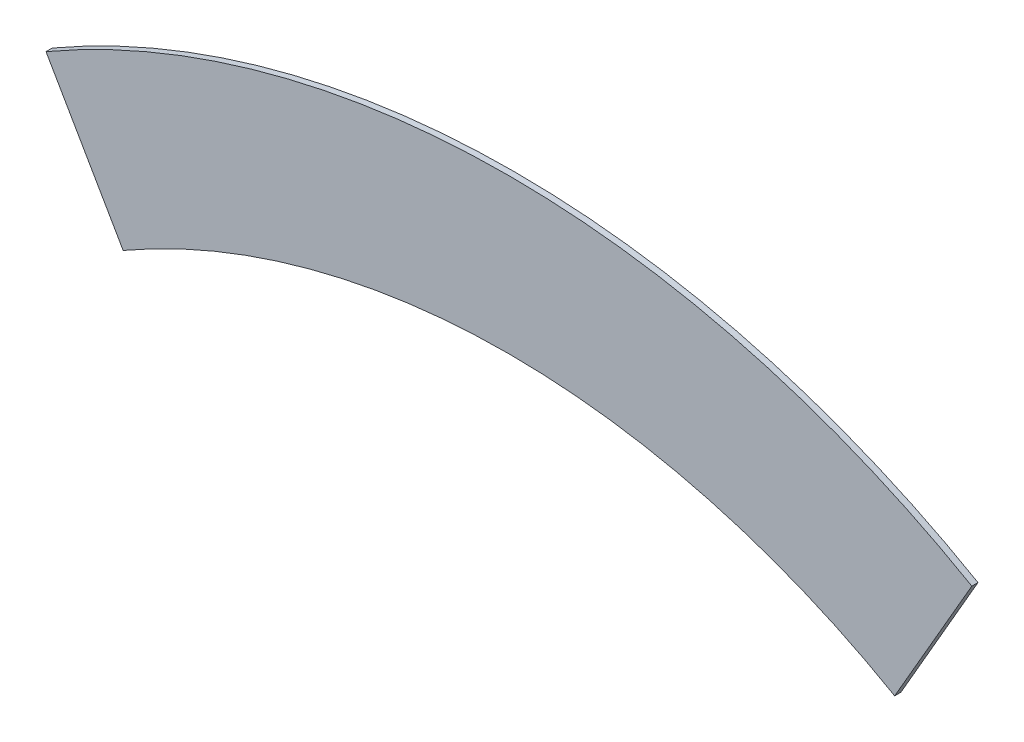
ISO-10303-21;
HEADER;
FILE_DESCRIPTION(('STEP AP214'),'2;1');
FILE_NAME('part.step','',(''),(''),'','','');
FILE_SCHEMA(('AUTOMOTIVE_DESIGN { 1 0 10303 214 1 1 1 1 }'));
ENDSEC;
DATA;
#1=APPLICATION_CONTEXT('core data for automotive mechanical design processes');
#2=APPLICATION_PROTOCOL_DEFINITION('international standard','automotive_design',2000,#1);
#3=PRODUCT_CONTEXT('',#1,'mechanical');
#4=PRODUCT('Part','Part','',(#3));
#5=PRODUCT_RELATED_PRODUCT_CATEGORY('part','',(#4));
#6=PRODUCT_DEFINITION_FORMATION('','',#4);
#7=PRODUCT_DEFINITION_CONTEXT('part definition',#1,'design');
#8=PRODUCT_DEFINITION('design','',#6,#7);
#9=PRODUCT_DEFINITION_SHAPE('','',#8);
#10=(LENGTH_UNIT() NAMED_UNIT(*) SI_UNIT(.MILLI.,.METRE.));
#11=(NAMED_UNIT(*) PLANE_ANGLE_UNIT() SI_UNIT($,.RADIAN.));
#12=(NAMED_UNIT(*) SI_UNIT($,.STERADIAN.) SOLID_ANGLE_UNIT());
#13=UNCERTAINTY_MEASURE_WITH_UNIT(LENGTH_MEASURE(1.E-05),#10,'distance_accuracy_value','');
#14=(GEOMETRIC_REPRESENTATION_CONTEXT(3) GLOBAL_UNCERTAINTY_ASSIGNED_CONTEXT((#13)) GLOBAL_UNIT_ASSIGNED_CONTEXT((#10,
#11,#12)) REPRESENTATION_CONTEXT('',''));
#15=CARTESIAN_POINT('',(0.,0.,0.));
#16=DIRECTION('',(0.,0.,1.));
#17=DIRECTION('',(1.,0.,0.));
#18=AXIS2_PLACEMENT_3D('',#15,#16,#17);
#19=CARTESIAN_POINT('',(0.,0.,0.2));
#20=DIRECTION('',(0.,0.,-1.));
#21=DIRECTION('',(-1.,0.,0.));
#22=AXIS2_PLACEMENT_3D('',#19,#20,#21);
#23=CYLINDRICAL_SURFACE('',#22,25.);
#24=CARTESIAN_POINT('',(0.,0.,0.));
#25=DIRECTION('',(0.,0.,-1.));
#26=DIRECTION('',(1.,0.,0.));
#27=AXIS2_PLACEMENT_3D('',#24,#25,#26);
#28=CIRCLE('',#27,25.);
#29=CARTESIAN_POINT('',(-12.5,21.650635094611,0.));
#30=VERTEX_POINT('',#29);
#31=CARTESIAN_POINT('',(12.5,21.650635094611,0.));
#32=VERTEX_POINT('',#31);
#33=EDGE_CURVE('E111',#30,#32,#28,.T.);
#34=ORIENTED_EDGE('',*,*,#33,.T.);
#35=DIRECTION('',(0.,0.,-1.));
#36=VECTOR('',#35,1.);
#37=CARTESIAN_POINT('',(12.5,21.650635094611,0.2));
#38=LINE('',#37,#36);
#39=CARTESIAN_POINT('',(12.5,21.650635094611,0.2));
#40=VERTEX_POINT('',#39);
#41=EDGE_CURVE('E11',#40,#32,#38,.T.);
#42=ORIENTED_EDGE('',*,*,#41,.F.);
#43=CARTESIAN_POINT('',(0.,0.,0.2));
#44=DIRECTION('',(0.,0.,-1.));
#45=DIRECTION('',(1.,0.,0.));
#46=AXIS2_PLACEMENT_3D('',#43,#44,#45);
#47=CIRCLE('',#46,25.);
#48=CARTESIAN_POINT('',(-12.5,21.650635094611,0.2));
#49=VERTEX_POINT('',#48);
#50=EDGE_CURVE('E95',#49,#40,#47,.T.);
#51=ORIENTED_EDGE('',*,*,#50,.F.);
#52=DIRECTION('',(0.,0.,-1.));
#53=VECTOR('',#52,1.);
#54=CARTESIAN_POINT('',(-12.5,21.650635094611,0.2));
#55=LINE('',#54,#53);
#56=EDGE_CURVE('E107',#49,#30,#55,.T.);
#57=ORIENTED_EDGE('',*,*,#56,.T.);
#58=EDGE_LOOP('',(#34,#42,#51,#57));
#59=FACE_BOUND('',#58,.T.);
#60=ADVANCED_FACE('F43',(#59),#23,.F.);
#61=CARTESIAN_POINT('',(12.5,21.650635094611,0.2));
#62=DIRECTION('',(-0.866025403784439,0.5,0.));
#63=DIRECTION('',(-0.5,-0.866025403784439,0.));
#64=AXIS2_PLACEMENT_3D('',#61,#62,#63);
#65=PLANE('',#64);
#66=DIRECTION('',(0.5,0.866025403784439,0.));
#67=VECTOR('',#66,1.);
#68=CARTESIAN_POINT('',(12.5,21.650635094611,0.));
#69=LINE('',#68,#67);
#70=CARTESIAN_POINT('',(15.,25.9807621135332,0.));
#71=VERTEX_POINT('',#70);
#72=EDGE_CURVE('E100',#32,#71,#69,.T.);
#73=ORIENTED_EDGE('',*,*,#72,.T.);
#74=DIRECTION('',(0.,0.,-1.));
#75=VECTOR('',#74,1.);
#76=CARTESIAN_POINT('',(15.,25.9807621135332,0.2));
#77=LINE('',#76,#75);
#78=CARTESIAN_POINT('',(15.,25.9807621135332,0.2));
#79=VERTEX_POINT('',#78);
#80=EDGE_CURVE('E52',#79,#71,#77,.T.);
#81=ORIENTED_EDGE('',*,*,#80,.F.);
#82=DIRECTION('',(0.5,0.866025403784439,0.));
#83=VECTOR('',#82,1.);
#84=CARTESIAN_POINT('',(12.5,21.650635094611,0.2));
#85=LINE('',#84,#83);
#86=EDGE_CURVE('E90',#40,#79,#85,.T.);
#87=ORIENTED_EDGE('',*,*,#86,.F.);
#88=ORIENTED_EDGE('',*,*,#41,.T.);
#89=EDGE_LOOP('',(#73,#81,#87,#88));
#90=FACE_BOUND('',#89,.T.);
#91=ADVANCED_FACE('F99',(#90),#65,.F.);
#92=CARTESIAN_POINT('',(0.,0.,0.2));
#93=DIRECTION('',(0.,0.,-1.));
#94=DIRECTION('',(-1.,0.,0.));
#95=AXIS2_PLACEMENT_3D('',#92,#93,#94);
#96=CYLINDRICAL_SURFACE('',#95,30.);
#97=CARTESIAN_POINT('',(0.,0.,0.));
#98=DIRECTION('',(0.,0.,1.));
#99=DIRECTION('',(1.,0.,0.));
#100=AXIS2_PLACEMENT_3D('',#97,#98,#99);
#101=CIRCLE('',#100,30.);
#102=CARTESIAN_POINT('',(-15.,25.9807621135332,0.));
#103=VERTEX_POINT('',#102);
#104=EDGE_CURVE('E77',#71,#103,#101,.T.);
#105=ORIENTED_EDGE('',*,*,#104,.T.);
#106=DIRECTION('',(0.,0.,-1.));
#107=VECTOR('',#106,1.);
#108=CARTESIAN_POINT('',(-15.,25.9807621135332,0.2));
#109=LINE('',#108,#107);
#110=CARTESIAN_POINT('',(-15.,25.9807621135332,0.2));
#111=VERTEX_POINT('',#110);
#112=EDGE_CURVE('E102',#111,#103,#109,.T.);
#113=ORIENTED_EDGE('',*,*,#112,.F.);
#114=CARTESIAN_POINT('',(0.,0.,0.2));
#115=DIRECTION('',(0.,0.,1.));
#116=DIRECTION('',(1.,0.,0.));
#117=AXIS2_PLACEMENT_3D('',#114,#115,#116);
#118=CIRCLE('',#117,30.);
#119=EDGE_CURVE('E93',#79,#111,#118,.T.);
#120=ORIENTED_EDGE('',*,*,#119,.F.);
#121=ORIENTED_EDGE('',*,*,#80,.T.);
#122=EDGE_LOOP('',(#105,#113,#120,#121));
#123=FACE_BOUND('',#122,.T.);
#124=ADVANCED_FACE('F103',(#123),#96,.T.);
#125=CARTESIAN_POINT('',(-12.5,21.650635094611,0.2));
#126=DIRECTION('',(0.866025403784439,0.5,0.));
#127=DIRECTION('',(-0.5,0.866025403784439,0.));
#128=AXIS2_PLACEMENT_3D('',#125,#126,#127);
#129=PLANE('',#128);
#130=DIRECTION('',(0.5,-0.866025403784439,0.));
#131=VECTOR('',#130,1.);
#132=CARTESIAN_POINT('',(-12.5,21.650635094611,0.));
#133=LINE('',#132,#131);
#134=EDGE_CURVE('E83',#103,#30,#133,.T.);
#135=ORIENTED_EDGE('',*,*,#134,.T.);
#136=ORIENTED_EDGE('',*,*,#56,.F.);
#137=DIRECTION('',(0.5,-0.866025403784439,0.));
#138=VECTOR('',#137,1.);
#139=CARTESIAN_POINT('',(-12.5,21.650635094611,0.2));
#140=LINE('',#139,#138);
#141=EDGE_CURVE('E60',#111,#49,#140,.T.);
#142=ORIENTED_EDGE('',*,*,#141,.F.);
#143=ORIENTED_EDGE('',*,*,#112,.T.);
#144=EDGE_LOOP('',(#135,#136,#142,#143));
#145=FACE_BOUND('',#144,.T.);
#146=ADVANCED_FACE('F124',(#145),#129,.F.);
#147=CARTESIAN_POINT('',(0.,0.,0.2));
#148=DIRECTION('',(0.,0.,1.));
#149=DIRECTION('',(1.,0.,0.));
#150=AXIS2_PLACEMENT_3D('',#147,#148,#149);
#151=PLANE('',#150);
#152=ORIENTED_EDGE('',*,*,#50,.T.);
#153=ORIENTED_EDGE('',*,*,#86,.T.);
#154=ORIENTED_EDGE('',*,*,#119,.T.);
#155=ORIENTED_EDGE('',*,*,#141,.T.);
#156=EDGE_LOOP('',(#152,#153,#154,#155));
#157=FACE_BOUND('',#156,.T.);
#158=ADVANCED_FACE('F91',(#157),#151,.T.);
#159=CARTESIAN_POINT('',(0.,0.,0.));
#160=DIRECTION('',(0.,0.,1.));
#161=DIRECTION('',(1.,0.,0.));
#162=AXIS2_PLACEMENT_3D('',#159,#160,#161);
#163=PLANE('',#162);
#164=ORIENTED_EDGE('',*,*,#33,.F.);
#165=ORIENTED_EDGE('',*,*,#134,.F.);
#166=ORIENTED_EDGE('',*,*,#104,.F.);
#167=ORIENTED_EDGE('',*,*,#72,.F.);
#168=EDGE_LOOP('',(#164,#165,#166,#167));
#169=FACE_BOUND('',#168,.T.);
#170=ADVANCED_FACE('F127',(#169),#163,.F.);
#171=CLOSED_SHELL('',(#60,#91,#124,#146,#158,#170));
#172=MANIFOLD_SOLID_BREP('B2',#171);
#173=ADVANCED_BREP_SHAPE_REPRESENTATION('',(#18,#172),#14);
#174=SHAPE_DEFINITION_REPRESENTATION(#9,#173);
ENDSEC;
END-ISO-10303-21;
